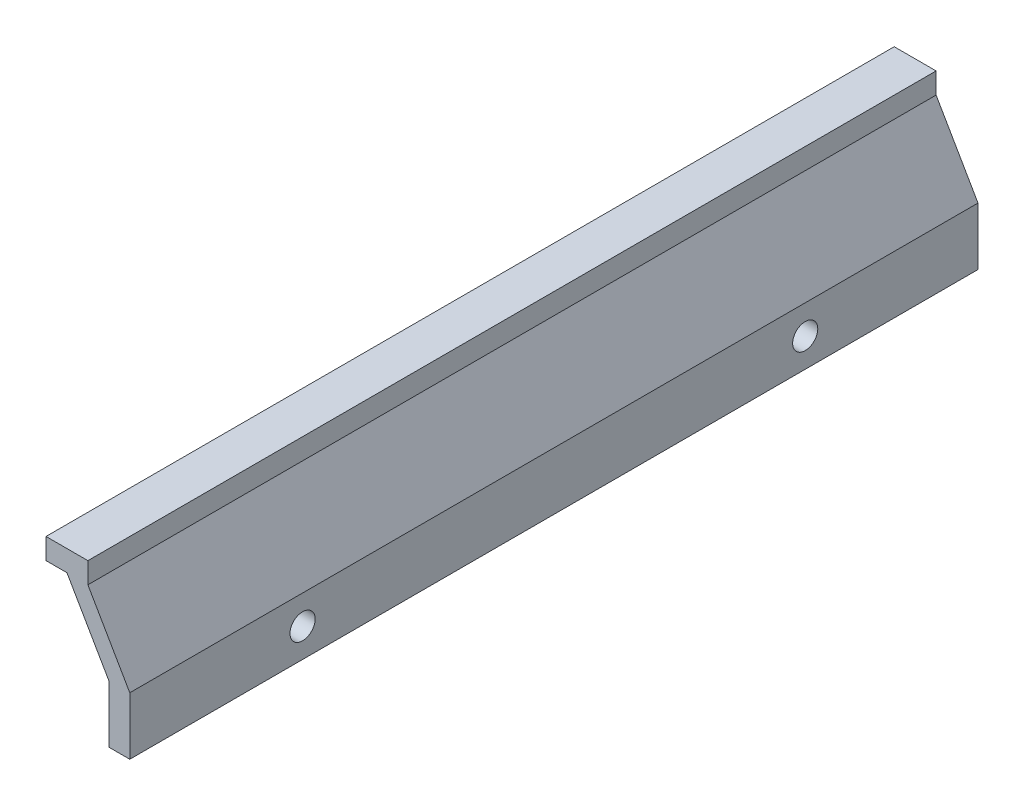
ISO-10303-21;
HEADER;
FILE_DESCRIPTION(('STEP AP214'),'2;1');
FILE_NAME('part.step','',(''),(''),'','','');
FILE_SCHEMA(('AUTOMOTIVE_DESIGN { 1 0 10303 214 1 1 1 1 }'));
ENDSEC;
DATA;
#1=APPLICATION_CONTEXT('core data for automotive mechanical design processes');
#2=APPLICATION_PROTOCOL_DEFINITION('international standard','automotive_design',2000,#1);
#3=PRODUCT_CONTEXT('',#1,'mechanical');
#4=PRODUCT('Part','Part','',(#3));
#5=PRODUCT_RELATED_PRODUCT_CATEGORY('part','',(#4));
#6=PRODUCT_DEFINITION_FORMATION('','',#4);
#7=PRODUCT_DEFINITION_CONTEXT('part definition',#1,'design');
#8=PRODUCT_DEFINITION('design','',#6,#7);
#9=PRODUCT_DEFINITION_SHAPE('','',#8);
#10=(LENGTH_UNIT() NAMED_UNIT(*) SI_UNIT(.MILLI.,.METRE.));
#11=(NAMED_UNIT(*) PLANE_ANGLE_UNIT() SI_UNIT($,.RADIAN.));
#12=(NAMED_UNIT(*) SI_UNIT($,.STERADIAN.) SOLID_ANGLE_UNIT());
#13=UNCERTAINTY_MEASURE_WITH_UNIT(LENGTH_MEASURE(1.E-05),#10,'distance_accuracy_value','');
#14=(GEOMETRIC_REPRESENTATION_CONTEXT(3) GLOBAL_UNCERTAINTY_ASSIGNED_CONTEXT((#13)) GLOBAL_UNIT_ASSIGNED_CONTEXT((#10,
#11,#12)) REPRESENTATION_CONTEXT('',''));
#15=CARTESIAN_POINT('',(0.,0.,0.));
#16=DIRECTION('',(0.,0.,1.));
#17=DIRECTION('',(1.,0.,0.));
#18=AXIS2_PLACEMENT_3D('',#15,#16,#17);
#19=CARTESIAN_POINT('',(-1.,-2.75,-5.));
#20=DIRECTION('',(-1.,0.,0.));
#21=DIRECTION('',(0.,0.,1.));
#22=AXIS2_PLACEMENT_3D('',#19,#20,#21);
#23=PLANE('',#22);
#24=CARTESIAN_POINT('',(-1.,0.,59.5));
#25=DIRECTION('',(-1.,0.,0.));
#26=DIRECTION('',(0.,0.,1.));
#27=AXIS2_PLACEMENT_3D('',#24,#25,#26);
#28=CIRCLE('',#27,1.2);
#29=CARTESIAN_POINT('',(-1.,0.,60.7));
#30=VERTEX_POINT('',#29);
#31=EDGE_CURVE('E122',#30,#30,#28,.T.);
#32=ORIENTED_EDGE('',*,*,#31,.F.);
#33=EDGE_LOOP('',(#32));
#34=FACE_BOUND('',#33,.T.);
#35=CARTESIAN_POINT('',(-1.,0.,11.5));
#36=DIRECTION('',(-1.,0.,0.));
#37=DIRECTION('',(0.,0.,1.));
#38=AXIS2_PLACEMENT_3D('',#35,#36,#37);
#39=CIRCLE('',#38,1.2);
#40=CARTESIAN_POINT('',(-1.,0.,12.7));
#41=VERTEX_POINT('',#40);
#42=EDGE_CURVE('E125',#41,#41,#39,.T.);
#43=ORIENTED_EDGE('',*,*,#42,.F.);
#44=EDGE_LOOP('',(#43));
#45=FACE_BOUND('',#44,.T.);
#46=DIRECTION('',(0.,0.,1.));
#47=VECTOR('',#46,1.);
#48=CARTESIAN_POINT('',(-1.,-2.75,-5.));
#49=LINE('',#48,#47);
#50=CARTESIAN_POINT('',(-1.,-2.75,-5.));
#51=VERTEX_POINT('',#50);
#52=CARTESIAN_POINT('',(-1.,-2.75,76.));
#53=VERTEX_POINT('',#52);
#54=EDGE_CURVE('E36',#51,#53,#49,.T.);
#55=ORIENTED_EDGE('',*,*,#54,.T.);
#56=DIRECTION('',(0.,-1.,0.));
#57=VECTOR('',#56,1.);
#58=CARTESIAN_POINT('',(-1.,-2.75,76.));
#59=LINE('',#58,#57);
#60=CARTESIAN_POINT('',(-1.,2.75,76.));
#61=VERTEX_POINT('',#60);
#62=EDGE_CURVE('E103',#61,#53,#59,.T.);
#63=ORIENTED_EDGE('',*,*,#62,.F.);
#64=DIRECTION('',(0.,0.,1.));
#65=VECTOR('',#64,1.);
#66=CARTESIAN_POINT('',(-1.,2.75,-5.));
#67=LINE('',#66,#65);
#68=CARTESIAN_POINT('',(-1.,2.75,-5.));
#69=VERTEX_POINT('',#68);
#70=EDGE_CURVE('E11',#69,#61,#67,.T.);
#71=ORIENTED_EDGE('',*,*,#70,.F.);
#72=DIRECTION('',(0.,-1.,0.));
#73=VECTOR('',#72,1.);
#74=CARTESIAN_POINT('',(-1.,-2.75,-5.));
#75=LINE('',#74,#73);
#76=EDGE_CURVE('E104',#69,#51,#75,.T.);
#77=ORIENTED_EDGE('',*,*,#76,.T.);
#78=EDGE_LOOP('',(#55,#63,#71,#77));
#79=FACE_BOUND('',#78,.T.);
#80=ADVANCED_FACE('F33',(#34,#45,#79),#23,.T.);
#81=CARTESIAN_POINT('',(-4.99999999999996,9.67820323027554,-5.));
#82=DIRECTION('',(-0.866025403784442,-0.499999999999995,0.));
#83=DIRECTION('',(0.499999999999995,-0.866025403784442,0.));
#84=AXIS2_PLACEMENT_3D('',#81,#82,#83);
#85=PLANE('',#84);
#86=ORIENTED_EDGE('',*,*,#70,.T.);
#87=DIRECTION('',(0.499999999999995,-0.866025403784442,0.));
#88=VECTOR('',#87,1.);
#89=CARTESIAN_POINT('',(-4.99999999999996,9.67820323027554,76.));
#90=LINE('',#89,#88);
#91=CARTESIAN_POINT('',(-4.99999999999996,9.67820323027554,76.));
#92=VERTEX_POINT('',#91);
#93=EDGE_CURVE('E121',#92,#61,#90,.T.);
#94=ORIENTED_EDGE('',*,*,#93,.F.);
#95=DIRECTION('',(0.,0.,1.));
#96=VECTOR('',#95,1.);
#97=CARTESIAN_POINT('',(-4.99999999999996,9.67820323027554,-5.));
#98=LINE('',#97,#96);
#99=CARTESIAN_POINT('',(-4.99999999999996,9.67820323027554,-5.));
#100=VERTEX_POINT('',#99);
#101=EDGE_CURVE('E41',#100,#92,#98,.T.);
#102=ORIENTED_EDGE('',*,*,#101,.F.);
#103=DIRECTION('',(0.499999999999995,-0.866025403784442,0.));
#104=VECTOR('',#103,1.);
#105=CARTESIAN_POINT('',(-4.99999999999996,9.67820323027554,-5.));
#106=LINE('',#105,#104);
#107=EDGE_CURVE('E109',#100,#69,#106,.T.);
#108=ORIENTED_EDGE('',*,*,#107,.T.);
#109=EDGE_LOOP('',(#86,#94,#102,#108));
#110=FACE_BOUND('',#109,.T.);
#111=ADVANCED_FACE('F202',(#110),#85,.T.);
#112=CARTESIAN_POINT('',(-4.99999999999996,9.67820323027554,-5.));
#113=DIRECTION('',(0.,-1.,0.));
#114=DIRECTION('',(0.,0.,-1.));
#115=AXIS2_PLACEMENT_3D('',#112,#113,#114);
#116=PLANE('',#115);
#117=ORIENTED_EDGE('',*,*,#101,.T.);
#118=DIRECTION('',(1.,0.,0.));
#119=VECTOR('',#118,1.);
#120=CARTESIAN_POINT('',(-4.99999999999996,9.67820323027554,76.));
#121=LINE('',#120,#119);
#122=CARTESIAN_POINT('',(-6.99999999999996,9.67820323027554,76.));
#123=VERTEX_POINT('',#122);
#124=EDGE_CURVE('E142',#123,#92,#121,.T.);
#125=ORIENTED_EDGE('',*,*,#124,.F.);
#126=DIRECTION('',(0.,0.,1.));
#127=VECTOR('',#126,1.);
#128=CARTESIAN_POINT('',(-6.99999999999996,9.67820323027554,-5.));
#129=LINE('',#128,#127);
#130=CARTESIAN_POINT('',(-6.99999999999996,9.67820323027554,-5.));
#131=VERTEX_POINT('',#130);
#132=EDGE_CURVE('E166',#131,#123,#129,.T.);
#133=ORIENTED_EDGE('',*,*,#132,.F.);
#134=DIRECTION('',(1.,0.,0.));
#135=VECTOR('',#134,1.);
#136=CARTESIAN_POINT('',(-4.99999999999996,9.67820323027554,-5.));
#137=LINE('',#136,#135);
#138=EDGE_CURVE('E162',#131,#100,#137,.T.);
#139=ORIENTED_EDGE('',*,*,#138,.T.);
#140=EDGE_LOOP('',(#117,#125,#133,#139));
#141=FACE_BOUND('',#140,.T.);
#142=ADVANCED_FACE('F200',(#141),#116,.T.);
#143=CARTESIAN_POINT('',(-6.99999999999996,9.67820323027554,-5.));
#144=DIRECTION('',(-1.,0.,0.));
#145=DIRECTION('',(0.,-1.,0.));
#146=AXIS2_PLACEMENT_3D('',#143,#144,#145);
#147=PLANE('',#146);
#148=ORIENTED_EDGE('',*,*,#132,.T.);
#149=DIRECTION('',(0.,-1.,0.));
#150=VECTOR('',#149,1.);
#151=CARTESIAN_POINT('',(-6.99999999999996,9.67820323027554,76.));
#152=LINE('',#151,#150);
#153=CARTESIAN_POINT('',(-6.99999999999996,11.6782032302755,76.));
#154=VERTEX_POINT('',#153);
#155=EDGE_CURVE('E139',#154,#123,#152,.T.);
#156=ORIENTED_EDGE('',*,*,#155,.F.);
#157=DIRECTION('',(0.,0.,1.));
#158=VECTOR('',#157,1.);
#159=CARTESIAN_POINT('',(-6.99999999999996,11.6782032302755,-5.));
#160=LINE('',#159,#158);
#161=CARTESIAN_POINT('',(-6.99999999999996,11.6782032302755,-5.));
#162=VERTEX_POINT('',#161);
#163=EDGE_CURVE('E168',#162,#154,#160,.T.);
#164=ORIENTED_EDGE('',*,*,#163,.F.);
#165=DIRECTION('',(0.,-1.,0.));
#166=VECTOR('',#165,1.);
#167=CARTESIAN_POINT('',(-6.99999999999996,9.67820323027554,-5.));
#168=LINE('',#167,#166);
#169=EDGE_CURVE('E159',#162,#131,#168,.T.);
#170=ORIENTED_EDGE('',*,*,#169,.T.);
#171=EDGE_LOOP('',(#148,#156,#164,#170));
#172=FACE_BOUND('',#171,.T.);
#173=ADVANCED_FACE('F197',(#172),#147,.T.);
#174=CARTESIAN_POINT('',(-6.99999999999996,11.6782032302755,-5.));
#175=DIRECTION('',(0.,1.,0.));
#176=DIRECTION('',(0.,0.,1.));
#177=AXIS2_PLACEMENT_3D('',#174,#175,#176);
#178=PLANE('',#177);
#179=ORIENTED_EDGE('',*,*,#163,.T.);
#180=DIRECTION('',(-1.,0.,0.));
#181=VECTOR('',#180,1.);
#182=CARTESIAN_POINT('',(-2.99999999999996,11.6782032302755,76.));
#183=LINE('',#182,#181);
#184=CARTESIAN_POINT('',(-2.99999999999996,11.6782032302755,76.));
#185=VERTEX_POINT('',#184);
#186=EDGE_CURVE('E136',#185,#154,#183,.T.);
#187=ORIENTED_EDGE('',*,*,#186,.F.);
#188=DIRECTION('',(0.,0.,1.));
#189=VECTOR('',#188,1.);
#190=CARTESIAN_POINT('',(-2.99999999999996,11.6782032302755,-5.));
#191=LINE('',#190,#189);
#192=CARTESIAN_POINT('',(-2.99999999999996,11.6782032302755,-5.));
#193=VERTEX_POINT('',#192);
#194=EDGE_CURVE('E170',#193,#185,#191,.T.);
#195=ORIENTED_EDGE('',*,*,#194,.F.);
#196=DIRECTION('',(-1.,0.,0.));
#197=VECTOR('',#196,1.);
#198=CARTESIAN_POINT('',(-2.99999999999996,11.6782032302755,-5.));
#199=LINE('',#198,#197);
#200=EDGE_CURVE('E157',#193,#162,#199,.T.);
#201=ORIENTED_EDGE('',*,*,#200,.T.);
#202=EDGE_LOOP('',(#179,#187,#195,#201));
#203=FACE_BOUND('',#202,.T.);
#204=ADVANCED_FACE('F193',(#203),#178,.T.);
#205=CARTESIAN_POINT('',(-2.99999999999996,11.6782032302755,-5.));
#206=DIRECTION('',(1.,0.,0.));
#207=DIRECTION('',(0.,0.,-1.));
#208=AXIS2_PLACEMENT_3D('',#205,#206,#207);
#209=PLANE('',#208);
#210=ORIENTED_EDGE('',*,*,#194,.T.);
#211=DIRECTION('',(0.,1.,0.));
#212=VECTOR('',#211,1.);
#213=CARTESIAN_POINT('',(-2.99999999999996,11.6782032302755,76.));
#214=LINE('',#213,#212);
#215=CARTESIAN_POINT('',(-2.99999999999996,9.67820323027554,76.));
#216=VERTEX_POINT('',#215);
#217=EDGE_CURVE('E133',#216,#185,#214,.T.);
#218=ORIENTED_EDGE('',*,*,#217,.F.);
#219=DIRECTION('',(0.,0.,1.));
#220=VECTOR('',#219,1.);
#221=CARTESIAN_POINT('',(-2.99999999999996,9.67820323027554,-5.));
#222=LINE('',#221,#220);
#223=CARTESIAN_POINT('',(-2.99999999999996,9.67820323027554,-5.));
#224=VERTEX_POINT('',#223);
#225=EDGE_CURVE('E172',#224,#216,#222,.T.);
#226=ORIENTED_EDGE('',*,*,#225,.F.);
#227=DIRECTION('',(0.,1.,0.));
#228=VECTOR('',#227,1.);
#229=CARTESIAN_POINT('',(-2.99999999999996,11.6782032302755,-5.));
#230=LINE('',#229,#228);
#231=EDGE_CURVE('E154',#224,#193,#230,.T.);
#232=ORIENTED_EDGE('',*,*,#231,.T.);
#233=EDGE_LOOP('',(#210,#218,#226,#232));
#234=FACE_BOUND('',#233,.T.);
#235=ADVANCED_FACE('F185',(#234),#209,.T.);
#236=CARTESIAN_POINT('',(-2.99999999999996,9.67820323027554,-5.));
#237=DIRECTION('',(0.866025403784442,0.499999999999995,0.));
#238=DIRECTION('',(-0.499999999999995,0.866025403784442,0.));
#239=AXIS2_PLACEMENT_3D('',#236,#237,#238);
#240=PLANE('',#239);
#241=ORIENTED_EDGE('',*,*,#225,.T.);
#242=DIRECTION('',(-0.499999999999995,0.866025403784441,0.));
#243=VECTOR('',#242,1.);
#244=CARTESIAN_POINT('',(-2.99999999999996,9.67820323027554,76.));
#245=LINE('',#244,#243);
#246=CARTESIAN_POINT('',(1.,2.75,76.));
#247=VERTEX_POINT('',#246);
#248=EDGE_CURVE('E130',#247,#216,#245,.T.);
#249=ORIENTED_EDGE('',*,*,#248,.F.);
#250=DIRECTION('',(0.,0.,1.));
#251=VECTOR('',#250,1.);
#252=CARTESIAN_POINT('',(1.,2.75,-5.));
#253=LINE('',#252,#251);
#254=CARTESIAN_POINT('',(1.,2.75,-5.));
#255=VERTEX_POINT('',#254);
#256=EDGE_CURVE('E174',#255,#247,#253,.T.);
#257=ORIENTED_EDGE('',*,*,#256,.F.);
#258=DIRECTION('',(-0.499999999999995,0.866025403784441,0.));
#259=VECTOR('',#258,1.);
#260=CARTESIAN_POINT('',(-2.99999999999996,9.67820323027554,-5.));
#261=LINE('',#260,#259);
#262=EDGE_CURVE('E151',#255,#224,#261,.T.);
#263=ORIENTED_EDGE('',*,*,#262,.T.);
#264=EDGE_LOOP('',(#241,#249,#257,#263));
#265=FACE_BOUND('',#264,.T.);
#266=ADVANCED_FACE('F182',(#265),#240,.T.);
#267=CARTESIAN_POINT('',(1.,-2.75,-5.));
#268=DIRECTION('',(1.,0.,0.));
#269=DIRECTION('',(0.,0.,-1.));
#270=AXIS2_PLACEMENT_3D('',#267,#268,#269);
#271=PLANE('',#270);
#272=CARTESIAN_POINT('',(1.,0.,59.5));
#273=DIRECTION('',(1.,0.,0.));
#274=DIRECTION('',(0.,0.,-1.));
#275=AXIS2_PLACEMENT_3D('',#272,#273,#274);
#276=CIRCLE('',#275,1.2);
#277=CARTESIAN_POINT('',(1.,0.,58.3));
#278=VERTEX_POINT('',#277);
#279=EDGE_CURVE('E247',#278,#278,#276,.T.);
#280=ORIENTED_EDGE('',*,*,#279,.F.);
#281=EDGE_LOOP('',(#280));
#282=FACE_BOUND('',#281,.T.);
#283=CARTESIAN_POINT('',(1.,0.,11.5));
#284=DIRECTION('',(1.,0.,0.));
#285=DIRECTION('',(0.,0.,-1.));
#286=AXIS2_PLACEMENT_3D('',#283,#284,#285);
#287=CIRCLE('',#286,1.2);
#288=CARTESIAN_POINT('',(1.,0.,10.3));
#289=VERTEX_POINT('',#288);
#290=EDGE_CURVE('E248',#289,#289,#287,.T.);
#291=ORIENTED_EDGE('',*,*,#290,.F.);
#292=EDGE_LOOP('',(#291));
#293=FACE_BOUND('',#292,.T.);
#294=ORIENTED_EDGE('',*,*,#256,.T.);
#295=DIRECTION('',(0.,1.,0.));
#296=VECTOR('',#295,1.);
#297=CARTESIAN_POINT('',(1.,-2.75,76.));
#298=LINE('',#297,#296);
#299=CARTESIAN_POINT('',(1.,-2.75,76.));
#300=VERTEX_POINT('',#299);
#301=EDGE_CURVE('E116',#300,#247,#298,.T.);
#302=ORIENTED_EDGE('',*,*,#301,.F.);
#303=DIRECTION('',(0.,0.,1.));
#304=VECTOR('',#303,1.);
#305=CARTESIAN_POINT('',(1.,-2.75,-5.));
#306=LINE('',#305,#304);
#307=CARTESIAN_POINT('',(1.,-2.75,-5.));
#308=VERTEX_POINT('',#307);
#309=EDGE_CURVE('E108',#308,#300,#306,.T.);
#310=ORIENTED_EDGE('',*,*,#309,.F.);
#311=DIRECTION('',(0.,1.,0.));
#312=VECTOR('',#311,1.);
#313=CARTESIAN_POINT('',(1.,-2.75,-5.));
#314=LINE('',#313,#312);
#315=EDGE_CURVE('E148',#308,#255,#314,.T.);
#316=ORIENTED_EDGE('',*,*,#315,.T.);
#317=EDGE_LOOP('',(#294,#302,#310,#316));
#318=FACE_BOUND('',#317,.T.);
#319=ADVANCED_FACE('F176',(#282,#293,#318),#271,.T.);
#320=CARTESIAN_POINT('',(1.,-2.75,-5.));
#321=DIRECTION('',(0.,-1.,0.));
#322=DIRECTION('',(1.,0.,0.));
#323=AXIS2_PLACEMENT_3D('',#320,#321,#322);
#324=PLANE('',#323);
#325=ORIENTED_EDGE('',*,*,#309,.T.);
#326=DIRECTION('',(1.,0.,0.));
#327=VECTOR('',#326,1.);
#328=CARTESIAN_POINT('',(1.,-2.75,76.));
#329=LINE('',#328,#327);
#330=EDGE_CURVE('E111',#53,#300,#329,.T.);
#331=ORIENTED_EDGE('',*,*,#330,.F.);
#332=ORIENTED_EDGE('',*,*,#54,.F.);
#333=DIRECTION('',(1.,0.,0.));
#334=VECTOR('',#333,1.);
#335=CARTESIAN_POINT('',(1.,-2.75,-5.));
#336=LINE('',#335,#334);
#337=EDGE_CURVE('E146',#51,#308,#336,.T.);
#338=ORIENTED_EDGE('',*,*,#337,.T.);
#339=EDGE_LOOP('',(#325,#331,#332,#338));
#340=FACE_BOUND('',#339,.T.);
#341=ADVANCED_FACE('F112',(#340),#324,.T.);
#342=CARTESIAN_POINT('',(0.,0.,-5.));
#343=DIRECTION('',(0.,0.,1.));
#344=DIRECTION('',(1.,0.,0.));
#345=AXIS2_PLACEMENT_3D('',#342,#343,#344);
#346=PLANE('',#345);
#347=ORIENTED_EDGE('',*,*,#76,.F.);
#348=ORIENTED_EDGE('',*,*,#107,.F.);
#349=ORIENTED_EDGE('',*,*,#138,.F.);
#350=ORIENTED_EDGE('',*,*,#169,.F.);
#351=ORIENTED_EDGE('',*,*,#200,.F.);
#352=ORIENTED_EDGE('',*,*,#231,.F.);
#353=ORIENTED_EDGE('',*,*,#262,.F.);
#354=ORIENTED_EDGE('',*,*,#315,.F.);
#355=ORIENTED_EDGE('',*,*,#337,.F.);
#356=EDGE_LOOP('',(#347,#348,#349,#350,#351,#352,#353,#354,#355));
#357=FACE_BOUND('',#356,.T.);
#358=ADVANCED_FACE('F188',(#357),#346,.F.);
#359=CARTESIAN_POINT('',(0.,0.,76.));
#360=DIRECTION('',(0.,0.,1.));
#361=DIRECTION('',(1.,0.,0.));
#362=AXIS2_PLACEMENT_3D('',#359,#360,#361);
#363=PLANE('',#362);
#364=ORIENTED_EDGE('',*,*,#62,.T.);
#365=ORIENTED_EDGE('',*,*,#330,.T.);
#366=ORIENTED_EDGE('',*,*,#301,.T.);
#367=ORIENTED_EDGE('',*,*,#248,.T.);
#368=ORIENTED_EDGE('',*,*,#217,.T.);
#369=ORIENTED_EDGE('',*,*,#186,.T.);
#370=ORIENTED_EDGE('',*,*,#155,.T.);
#371=ORIENTED_EDGE('',*,*,#124,.T.);
#372=ORIENTED_EDGE('',*,*,#93,.T.);
#373=EDGE_LOOP('',(#364,#365,#366,#367,#368,#369,#370,#371,#372));
#374=FACE_BOUND('',#373,.T.);
#375=ADVANCED_FACE('F119',(#374),#363,.T.);
#376=CARTESIAN_POINT('',(-6.99999999999996,0.,11.5));
#377=DIRECTION('',(1.,0.,0.));
#378=DIRECTION('',(0.,0.,-1.));
#379=AXIS2_PLACEMENT_3D('',#376,#377,#378);
#380=CYLINDRICAL_SURFACE('',#379,1.2);
#381=ORIENTED_EDGE('',*,*,#42,.T.);
#382=EDGE_LOOP('',(#381));
#383=FACE_BOUND('',#382,.T.);
#384=ORIENTED_EDGE('',*,*,#290,.T.);
#385=EDGE_LOOP('',(#384));
#386=FACE_BOUND('',#385,.T.);
#387=ADVANCED_FACE('F231',(#383,#386),#380,.F.);
#388=CARTESIAN_POINT('',(-6.99999999999996,0.,59.5));
#389=DIRECTION('',(1.,0.,0.));
#390=DIRECTION('',(0.,0.,-1.));
#391=AXIS2_PLACEMENT_3D('',#388,#389,#390);
#392=CYLINDRICAL_SURFACE('',#391,1.2);
#393=ORIENTED_EDGE('',*,*,#31,.T.);
#394=EDGE_LOOP('',(#393));
#395=FACE_BOUND('',#394,.T.);
#396=ORIENTED_EDGE('',*,*,#279,.T.);
#397=EDGE_LOOP('',(#396));
#398=FACE_BOUND('',#397,.T.);
#399=ADVANCED_FACE('F235',(#395,#398),#392,.F.);
#400=CLOSED_SHELL('',(#80,#111,#142,#173,#204,#235,#266,#319,#341,#358,#375,#387,#399));
#401=MANIFOLD_SOLID_BREP('B2',#400);
#402=ADVANCED_BREP_SHAPE_REPRESENTATION('',(#18,#401),#14);
#403=SHAPE_DEFINITION_REPRESENTATION(#9,#402);
ENDSEC;
END-ISO-10303-21;
